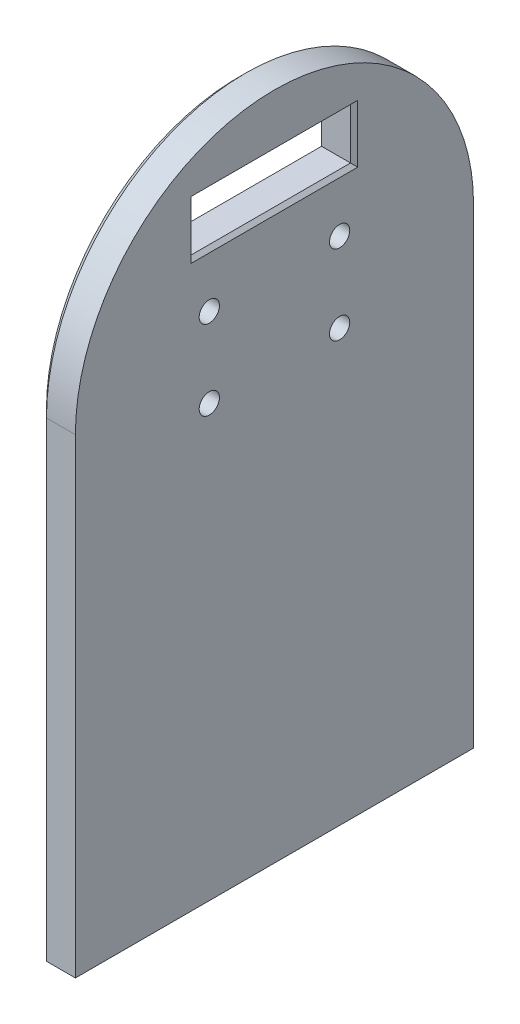
ISO-10303-21;
HEADER;
FILE_DESCRIPTION(('STEP AP214'),'2;1');
FILE_NAME('part.step','',(''),(''),'','','');
FILE_SCHEMA(('AUTOMOTIVE_DESIGN { 1 0 10303 214 1 1 1 1 }'));
ENDSEC;
DATA;
#1=APPLICATION_CONTEXT('core data for automotive mechanical design processes');
#2=APPLICATION_PROTOCOL_DEFINITION('international standard','automotive_design',2000,#1);
#3=PRODUCT_CONTEXT('',#1,'mechanical');
#4=PRODUCT('Part','Part','',(#3));
#5=PRODUCT_RELATED_PRODUCT_CATEGORY('part','',(#4));
#6=PRODUCT_DEFINITION_FORMATION('','',#4);
#7=PRODUCT_DEFINITION_CONTEXT('part definition',#1,'design');
#8=PRODUCT_DEFINITION('design','',#6,#7);
#9=PRODUCT_DEFINITION_SHAPE('','',#8);
#10=(LENGTH_UNIT() NAMED_UNIT(*) SI_UNIT(.MILLI.,.METRE.));
#11=(NAMED_UNIT(*) PLANE_ANGLE_UNIT() SI_UNIT($,.RADIAN.));
#12=(NAMED_UNIT(*) SI_UNIT($,.STERADIAN.) SOLID_ANGLE_UNIT());
#13=UNCERTAINTY_MEASURE_WITH_UNIT(LENGTH_MEASURE(1.E-05),#10,'distance_accuracy_value','');
#14=(GEOMETRIC_REPRESENTATION_CONTEXT(3) GLOBAL_UNCERTAINTY_ASSIGNED_CONTEXT((#13)) GLOBAL_UNIT_ASSIGNED_CONTEXT((#10,
#11,#12)) REPRESENTATION_CONTEXT('',''));
#15=CARTESIAN_POINT('',(0.,0.,0.));
#16=DIRECTION('',(0.,0.,1.));
#17=DIRECTION('',(1.,0.,0.));
#18=AXIS2_PLACEMENT_3D('',#15,#16,#17);
#19=CARTESIAN_POINT('',(5.,0.,0.));
#20=DIRECTION('',(-1.,0.,0.));
#21=DIRECTION('',(0.,0.,1.));
#22=AXIS2_PLACEMENT_3D('',#19,#20,#21);
#23=CYLINDRICAL_SURFACE('',#22,27.5);
#24=DIRECTION('',(-1.,0.,0.));
#25=VECTOR('',#24,1.);
#26=CARTESIAN_POINT('',(5.,0.,-27.5));
#27=LINE('',#26,#25);
#28=CARTESIAN_POINT('',(5.,0.,-27.5));
#29=VERTEX_POINT('',#28);
#30=CARTESIAN_POINT('',(1.,0.,-27.5));
#31=VERTEX_POINT('',#30);
#32=EDGE_CURVE('E305',#29,#31,#27,.T.);
#33=ORIENTED_EDGE('',*,*,#32,.T.);
#34=CARTESIAN_POINT('',(1.,0.,0.));
#35=DIRECTION('',(1.,0.,0.));
#36=DIRECTION('',(0.,0.,-1.));
#37=AXIS2_PLACEMENT_3D('',#34,#35,#36);
#38=CIRCLE('',#37,27.5);
#39=CARTESIAN_POINT('',(1.,0.,27.5));
#40=VERTEX_POINT('',#39);
#41=EDGE_CURVE('E166',#31,#40,#38,.T.);
#42=ORIENTED_EDGE('',*,*,#41,.T.);
#43=DIRECTION('',(-1.,0.,0.));
#44=VECTOR('',#43,1.);
#45=CARTESIAN_POINT('',(5.,0.,27.5));
#46=LINE('',#45,#44);
#47=CARTESIAN_POINT('',(5.,0.,27.5));
#48=VERTEX_POINT('',#47);
#49=EDGE_CURVE('E147',#48,#40,#46,.T.);
#50=ORIENTED_EDGE('',*,*,#49,.F.);
#51=CARTESIAN_POINT('',(5.,0.,0.));
#52=DIRECTION('',(1.,0.,0.));
#53=DIRECTION('',(0.,0.,-1.));
#54=AXIS2_PLACEMENT_3D('',#51,#52,#53);
#55=CIRCLE('',#54,27.5);
#56=EDGE_CURVE('E154',#29,#48,#55,.T.);
#57=ORIENTED_EDGE('',*,*,#56,.F.);
#58=EDGE_LOOP('',(#33,#42,#50,#57));
#59=FACE_BOUND('',#58,.T.);
#60=ADVANCED_FACE('F38',(#59),#23,.T.);
#61=CARTESIAN_POINT('',(5.,0.,27.5));
#62=DIRECTION('',(0.,0.,-1.));
#63=DIRECTION('',(0.,1.,0.));
#64=AXIS2_PLACEMENT_3D('',#61,#62,#63);
#65=PLANE('',#64);
#66=ORIENTED_EDGE('',*,*,#49,.T.);
#67=DIRECTION('',(0.,-1.,0.));
#68=VECTOR('',#67,1.);
#69=CARTESIAN_POINT('',(1.,0.,27.5));
#70=LINE('',#69,#68);
#71=CARTESIAN_POINT('',(1.,-65.,27.5));
#72=VERTEX_POINT('',#71);
#73=EDGE_CURVE('E167',#40,#72,#70,.T.);
#74=ORIENTED_EDGE('',*,*,#73,.T.);
#75=DIRECTION('',(-1.,0.,0.));
#76=VECTOR('',#75,1.);
#77=CARTESIAN_POINT('',(5.,-65.,27.5));
#78=LINE('',#77,#76);
#79=CARTESIAN_POINT('',(5.,-65.,27.5));
#80=VERTEX_POINT('',#79);
#81=EDGE_CURVE('E150',#80,#72,#78,.T.);
#82=ORIENTED_EDGE('',*,*,#81,.F.);
#83=DIRECTION('',(0.,-1.,0.));
#84=VECTOR('',#83,1.);
#85=CARTESIAN_POINT('',(5.,0.,27.5));
#86=LINE('',#85,#84);
#87=EDGE_CURVE('E142',#48,#80,#86,.T.);
#88=ORIENTED_EDGE('',*,*,#87,.F.);
#89=EDGE_LOOP('',(#66,#74,#82,#88));
#90=FACE_BOUND('',#89,.T.);
#91=ADVANCED_FACE('F144',(#90),#65,.F.);
#92=CARTESIAN_POINT('',(5.,-65.,27.5));
#93=DIRECTION('',(0.,1.,0.));
#94=DIRECTION('',(0.,0.,1.));
#95=AXIS2_PLACEMENT_3D('',#92,#93,#94);
#96=PLANE('',#95);
#97=ORIENTED_EDGE('',*,*,#81,.T.);
#98=DIRECTION('',(0.,0.,-1.));
#99=VECTOR('',#98,1.);
#100=CARTESIAN_POINT('',(1.,-65.,27.5));
#101=LINE('',#100,#99);
#102=CARTESIAN_POINT('',(1.,-65.,-27.5));
#103=VERTEX_POINT('',#102);
#104=EDGE_CURVE('E183',#72,#103,#101,.T.);
#105=ORIENTED_EDGE('',*,*,#104,.T.);
#106=DIRECTION('',(-1.,0.,0.));
#107=VECTOR('',#106,1.);
#108=CARTESIAN_POINT('',(5.,-65.,-27.5));
#109=LINE('',#108,#107);
#110=CARTESIAN_POINT('',(5.,-65.,-27.5));
#111=VERTEX_POINT('',#110);
#112=EDGE_CURVE('E171',#111,#103,#109,.T.);
#113=ORIENTED_EDGE('',*,*,#112,.F.);
#114=DIRECTION('',(0.,0.,-1.));
#115=VECTOR('',#114,1.);
#116=CARTESIAN_POINT('',(5.,-65.,27.5));
#117=LINE('',#116,#115);
#118=EDGE_CURVE('E153',#80,#111,#117,.T.);
#119=ORIENTED_EDGE('',*,*,#118,.F.);
#120=EDGE_LOOP('',(#97,#105,#113,#119));
#121=FACE_BOUND('',#120,.T.);
#122=ADVANCED_FACE('F347',(#121),#96,.F.);
#123=CARTESIAN_POINT('',(5.,-65.,-27.5));
#124=DIRECTION('',(0.,0.,1.));
#125=DIRECTION('',(0.,-1.,0.));
#126=AXIS2_PLACEMENT_3D('',#123,#124,#125);
#127=PLANE('',#126);
#128=ORIENTED_EDGE('',*,*,#112,.T.);
#129=DIRECTION('',(0.,1.,0.));
#130=VECTOR('',#129,1.);
#131=CARTESIAN_POINT('',(1.,-65.,-27.5));
#132=LINE('',#131,#130);
#133=EDGE_CURVE('E185',#103,#31,#132,.T.);
#134=ORIENTED_EDGE('',*,*,#133,.T.);
#135=ORIENTED_EDGE('',*,*,#32,.F.);
#136=DIRECTION('',(0.,1.,0.));
#137=VECTOR('',#136,1.);
#138=CARTESIAN_POINT('',(5.,-65.,-27.5));
#139=LINE('',#138,#137);
#140=EDGE_CURVE('E159',#111,#29,#139,.T.);
#141=ORIENTED_EDGE('',*,*,#140,.F.);
#142=EDGE_LOOP('',(#128,#134,#135,#141));
#143=FACE_BOUND('',#142,.T.);
#144=ADVANCED_FACE('F310',(#143),#127,.F.);
#145=CARTESIAN_POINT('',(5.,0.,0.));
#146=DIRECTION('',(1.,0.,0.));
#147=DIRECTION('',(0.,0.,-1.));
#148=AXIS2_PLACEMENT_3D('',#145,#146,#147);
#149=PLANE('',#148);
#150=DIRECTION('',(0.,0.,1.));
#151=VECTOR('',#150,1.);
#152=CARTESIAN_POINT('',(5.,12.5,11.));
#153=LINE('',#152,#151);
#154=CARTESIAN_POINT('',(5.,12.5,-11.5));
#155=VERTEX_POINT('',#154);
#156=CARTESIAN_POINT('',(5.,12.5,11.5));
#157=VERTEX_POINT('',#156);
#158=EDGE_CURVE('E227',#155,#157,#153,.T.);
#159=ORIENTED_EDGE('',*,*,#158,.T.);
#160=DIRECTION('',(0.,1.,0.));
#161=VECTOR('',#160,1.);
#162=CARTESIAN_POINT('',(5.,20.,11.5));
#163=LINE('',#162,#161);
#164=CARTESIAN_POINT('',(5.,20.5,11.5));
#165=VERTEX_POINT('',#164);
#166=EDGE_CURVE('E11',#157,#165,#163,.T.);
#167=ORIENTED_EDGE('',*,*,#166,.T.);
#168=DIRECTION('',(0.,0.,-1.));
#169=VECTOR('',#168,1.);
#170=CARTESIAN_POINT('',(5.,20.5,-11.));
#171=LINE('',#170,#169);
#172=CARTESIAN_POINT('',(5.,20.5,-11.5));
#173=VERTEX_POINT('',#172);
#174=EDGE_CURVE('E48',#165,#173,#171,.T.);
#175=ORIENTED_EDGE('',*,*,#174,.T.);
#176=DIRECTION('',(0.,-1.,0.));
#177=VECTOR('',#176,1.);
#178=CARTESIAN_POINT('',(5.,13.,-11.5));
#179=LINE('',#178,#177);
#180=EDGE_CURVE('E229',#173,#155,#179,.T.);
#181=ORIENTED_EDGE('',*,*,#180,.T.);
#182=EDGE_LOOP('',(#159,#167,#175,#181));
#183=FACE_BOUND('',#182,.T.);
#184=CARTESIAN_POINT('',(5.,-5.5,9.));
#185=DIRECTION('',(1.,0.,0.));
#186=DIRECTION('',(0.,0.,-1.));
#187=AXIS2_PLACEMENT_3D('',#184,#185,#186);
#188=CIRCLE('',#187,1.4);
#189=CARTESIAN_POINT('',(5.,-5.5,7.6));
#190=VERTEX_POINT('',#189);
#191=EDGE_CURVE('E200',#190,#190,#188,.T.);
#192=ORIENTED_EDGE('',*,*,#191,.F.);
#193=EDGE_LOOP('',(#192));
#194=FACE_BOUND('',#193,.T.);
#195=CARTESIAN_POINT('',(5.,-5.5,-9.));
#196=DIRECTION('',(1.,0.,0.));
#197=DIRECTION('',(0.,0.,-1.));
#198=AXIS2_PLACEMENT_3D('',#195,#196,#197);
#199=CIRCLE('',#198,1.4);
#200=CARTESIAN_POINT('',(5.,-5.5,-10.4));
#201=VERTEX_POINT('',#200);
#202=EDGE_CURVE('E291',#201,#201,#199,.T.);
#203=ORIENTED_EDGE('',*,*,#202,.F.);
#204=EDGE_LOOP('',(#203));
#205=FACE_BOUND('',#204,.T.);
#206=CARTESIAN_POINT('',(5.,5.5,-9.));
#207=DIRECTION('',(1.,0.,0.));
#208=DIRECTION('',(0.,0.,-1.));
#209=AXIS2_PLACEMENT_3D('',#206,#207,#208);
#210=CIRCLE('',#209,1.4);
#211=CARTESIAN_POINT('',(5.,5.5,-10.4));
#212=VERTEX_POINT('',#211);
#213=EDGE_CURVE('E285',#212,#212,#210,.T.);
#214=ORIENTED_EDGE('',*,*,#213,.F.);
#215=EDGE_LOOP('',(#214));
#216=FACE_BOUND('',#215,.T.);
#217=CARTESIAN_POINT('',(5.,5.5,9.));
#218=DIRECTION('',(1.,0.,0.));
#219=DIRECTION('',(0.,0.,-1.));
#220=AXIS2_PLACEMENT_3D('',#217,#218,#219);
#221=CIRCLE('',#220,1.4);
#222=CARTESIAN_POINT('',(5.,5.5,7.6));
#223=VERTEX_POINT('',#222);
#224=EDGE_CURVE('E284',#223,#223,#221,.T.);
#225=ORIENTED_EDGE('',*,*,#224,.F.);
#226=EDGE_LOOP('',(#225));
#227=FACE_BOUND('',#226,.T.);
#228=ORIENTED_EDGE('',*,*,#56,.T.);
#229=ORIENTED_EDGE('',*,*,#87,.T.);
#230=ORIENTED_EDGE('',*,*,#118,.T.);
#231=ORIENTED_EDGE('',*,*,#140,.T.);
#232=EDGE_LOOP('',(#228,#229,#230,#231));
#233=FACE_BOUND('',#232,.T.);
#234=ADVANCED_FACE('F157',(#183,#194,#205,#216,#227,#233),#149,.T.);
#235=CARTESIAN_POINT('',(0.,0.,0.));
#236=DIRECTION('',(1.,0.,0.));
#237=DIRECTION('',(0.,0.,-1.));
#238=AXIS2_PLACEMENT_3D('',#235,#236,#237);
#239=PLANE('',#238);
#240=DIRECTION('',(0.,0.,1.));
#241=VECTOR('',#240,1.);
#242=CARTESIAN_POINT('',(0.,20.5,0.));
#243=LINE('',#242,#241);
#244=CARTESIAN_POINT('',(0.,20.5,-11.5));
#245=VERTEX_POINT('',#244);
#246=CARTESIAN_POINT('',(0.,20.5,11.5));
#247=VERTEX_POINT('',#246);
#248=EDGE_CURVE('E210',#245,#247,#243,.T.);
#249=ORIENTED_EDGE('',*,*,#248,.T.);
#250=DIRECTION('',(0.,-1.,0.));
#251=VECTOR('',#250,1.);
#252=CARTESIAN_POINT('',(0.,0.,11.5));
#253=LINE('',#252,#251);
#254=CARTESIAN_POINT('',(0.,12.5,11.5));
#255=VERTEX_POINT('',#254);
#256=EDGE_CURVE('E212',#247,#255,#253,.T.);
#257=ORIENTED_EDGE('',*,*,#256,.T.);
#258=DIRECTION('',(0.,0.,-1.));
#259=VECTOR('',#258,1.);
#260=CARTESIAN_POINT('',(0.,12.5,0.));
#261=LINE('',#260,#259);
#262=CARTESIAN_POINT('',(0.,12.5,-11.5));
#263=VERTEX_POINT('',#262);
#264=EDGE_CURVE('E206',#255,#263,#261,.T.);
#265=ORIENTED_EDGE('',*,*,#264,.T.);
#266=DIRECTION('',(0.,1.,0.));
#267=VECTOR('',#266,1.);
#268=CARTESIAN_POINT('',(0.,0.,-11.5));
#269=LINE('',#268,#267);
#270=EDGE_CURVE('E208',#263,#245,#269,.T.);
#271=ORIENTED_EDGE('',*,*,#270,.T.);
#272=EDGE_LOOP('',(#249,#257,#265,#271));
#273=FACE_BOUND('',#272,.T.);
#274=DIRECTION('',(0.,0.,1.));
#275=VECTOR('',#274,1.);
#276=CARTESIAN_POINT('',(0.,-64.,0.));
#277=LINE('',#276,#275);
#278=CARTESIAN_POINT('',(0.,-64.,-26.5));
#279=VERTEX_POINT('',#278);
#280=CARTESIAN_POINT('',(0.,-64.,26.5));
#281=VERTEX_POINT('',#280);
#282=EDGE_CURVE('E178',#279,#281,#277,.T.);
#283=ORIENTED_EDGE('',*,*,#282,.T.);
#284=DIRECTION('',(0.,1.,0.));
#285=VECTOR('',#284,1.);
#286=CARTESIAN_POINT('',(0.,0.,26.5));
#287=LINE('',#286,#285);
#288=CARTESIAN_POINT('',(0.,0.,26.5));
#289=VERTEX_POINT('',#288);
#290=EDGE_CURVE('E180',#281,#289,#287,.T.);
#291=ORIENTED_EDGE('',*,*,#290,.T.);
#292=CARTESIAN_POINT('',(0.,0.,0.));
#293=DIRECTION('',(1.,0.,0.));
#294=DIRECTION('',(0.,0.,-1.));
#295=AXIS2_PLACEMENT_3D('',#292,#293,#294);
#296=CIRCLE('',#295,26.5);
#297=CARTESIAN_POINT('',(0.,0.,-26.5));
#298=VERTEX_POINT('',#297);
#299=EDGE_CURVE('E169',#289,#298,#296,.F.);
#300=ORIENTED_EDGE('',*,*,#299,.T.);
#301=DIRECTION('',(0.,-1.,0.));
#302=VECTOR('',#301,1.);
#303=CARTESIAN_POINT('',(0.,0.,-26.5));
#304=LINE('',#303,#302);
#305=EDGE_CURVE('E176',#298,#279,#304,.T.);
#306=ORIENTED_EDGE('',*,*,#305,.T.);
#307=EDGE_LOOP('',(#283,#291,#300,#306));
#308=FACE_BOUND('',#307,.T.);
#309=CARTESIAN_POINT('',(0.,-5.5,9.));
#310=DIRECTION('',(1.,0.,0.));
#311=DIRECTION('',(0.,0.,-1.));
#312=AXIS2_PLACEMENT_3D('',#309,#310,#311);
#313=CIRCLE('',#312,1.4);
#314=CARTESIAN_POINT('',(0.,-5.5,7.6));
#315=VERTEX_POINT('',#314);
#316=EDGE_CURVE('E294',#315,#315,#313,.T.);
#317=ORIENTED_EDGE('',*,*,#316,.T.);
#318=EDGE_LOOP('',(#317));
#319=FACE_BOUND('',#318,.T.);
#320=CARTESIAN_POINT('',(0.,-5.5,-9.));
#321=DIRECTION('',(1.,0.,0.));
#322=DIRECTION('',(0.,0.,-1.));
#323=AXIS2_PLACEMENT_3D('',#320,#321,#322);
#324=CIRCLE('',#323,1.4);
#325=CARTESIAN_POINT('',(0.,-5.5,-10.4));
#326=VERTEX_POINT('',#325);
#327=EDGE_CURVE('E288',#326,#326,#324,.T.);
#328=ORIENTED_EDGE('',*,*,#327,.T.);
#329=EDGE_LOOP('',(#328));
#330=FACE_BOUND('',#329,.T.);
#331=CARTESIAN_POINT('',(0.,5.5,-9.));
#332=DIRECTION('',(1.,0.,0.));
#333=DIRECTION('',(0.,0.,-1.));
#334=AXIS2_PLACEMENT_3D('',#331,#332,#333);
#335=CIRCLE('',#334,1.4);
#336=CARTESIAN_POINT('',(0.,5.5,-10.4));
#337=VERTEX_POINT('',#336);
#338=EDGE_CURVE('E281',#337,#337,#335,.T.);
#339=ORIENTED_EDGE('',*,*,#338,.T.);
#340=EDGE_LOOP('',(#339));
#341=FACE_BOUND('',#340,.T.);
#342=CARTESIAN_POINT('',(0.,5.5,9.));
#343=DIRECTION('',(1.,0.,0.));
#344=DIRECTION('',(0.,0.,-1.));
#345=AXIS2_PLACEMENT_3D('',#342,#343,#344);
#346=CIRCLE('',#345,1.4);
#347=CARTESIAN_POINT('',(0.,5.5,7.6));
#348=VERTEX_POINT('',#347);
#349=EDGE_CURVE('E163',#348,#348,#346,.T.);
#350=ORIENTED_EDGE('',*,*,#349,.T.);
#351=EDGE_LOOP('',(#350));
#352=FACE_BOUND('',#351,.T.);
#353=ADVANCED_FACE('F324',(#273,#308,#319,#330,#341,#352),#239,.F.);
#354=CARTESIAN_POINT('',(0.,5.5,9.));
#355=DIRECTION('',(1.,0.,0.));
#356=DIRECTION('',(0.,0.,-1.));
#357=AXIS2_PLACEMENT_3D('',#354,#355,#356);
#358=CYLINDRICAL_SURFACE('',#357,1.4);
#359=ORIENTED_EDGE('',*,*,#349,.F.);
#360=EDGE_LOOP('',(#359));
#361=FACE_BOUND('',#360,.T.);
#362=ORIENTED_EDGE('',*,*,#224,.T.);
#363=EDGE_LOOP('',(#362));
#364=FACE_BOUND('',#363,.T.);
#365=ADVANCED_FACE('F530',(#361,#364),#358,.F.);
#366=CARTESIAN_POINT('',(0.,5.5,-9.));
#367=DIRECTION('',(1.,0.,0.));
#368=DIRECTION('',(0.,0.,-1.));
#369=AXIS2_PLACEMENT_3D('',#366,#367,#368);
#370=CYLINDRICAL_SURFACE('',#369,1.4);
#371=ORIENTED_EDGE('',*,*,#338,.F.);
#372=EDGE_LOOP('',(#371));
#373=FACE_BOUND('',#372,.T.);
#374=ORIENTED_EDGE('',*,*,#213,.T.);
#375=EDGE_LOOP('',(#374));
#376=FACE_BOUND('',#375,.T.);
#377=ADVANCED_FACE('F520',(#373,#376),#370,.F.);
#378=CARTESIAN_POINT('',(0.,-5.5,-9.));
#379=DIRECTION('',(1.,0.,0.));
#380=DIRECTION('',(0.,0.,-1.));
#381=AXIS2_PLACEMENT_3D('',#378,#379,#380);
#382=CYLINDRICAL_SURFACE('',#381,1.4);
#383=ORIENTED_EDGE('',*,*,#327,.F.);
#384=EDGE_LOOP('',(#383));
#385=FACE_BOUND('',#384,.T.);
#386=ORIENTED_EDGE('',*,*,#202,.T.);
#387=EDGE_LOOP('',(#386));
#388=FACE_BOUND('',#387,.T.);
#389=ADVANCED_FACE('F510',(#385,#388),#382,.F.);
#390=CARTESIAN_POINT('',(0.,-5.5,9.));
#391=DIRECTION('',(1.,0.,0.));
#392=DIRECTION('',(0.,0.,-1.));
#393=AXIS2_PLACEMENT_3D('',#390,#391,#392);
#394=CYLINDRICAL_SURFACE('',#393,1.4);
#395=ORIENTED_EDGE('',*,*,#316,.F.);
#396=EDGE_LOOP('',(#395));
#397=FACE_BOUND('',#396,.T.);
#398=ORIENTED_EDGE('',*,*,#191,.T.);
#399=EDGE_LOOP('',(#398));
#400=FACE_BOUND('',#399,.T.);
#401=ADVANCED_FACE('F339',(#397,#400),#394,.F.);
#402=CARTESIAN_POINT('',(1.,-65.,-27.5));
#403=DIRECTION('',(0.70710678118655,0.,0.707106781186545));
#404=DIRECTION('',(0.,1.,0.));
#405=AXIS2_PLACEMENT_3D('',#402,#403,#404);
#406=PLANE('',#405);
#407=DIRECTION('',(-0.577350269189622,0.577350269189628,0.577350269189626));
#408=VECTOR('',#407,1.);
#409=CARTESIAN_POINT('',(1.,-65.,-27.5));
#410=LINE('',#409,#408);
#411=EDGE_CURVE('E194',#279,#103,#410,.F.);
#412=ORIENTED_EDGE('',*,*,#411,.F.);
#413=ORIENTED_EDGE('',*,*,#305,.F.);
#414=DIRECTION('',(-0.707106781186545,0.,0.70710678118655));
#415=VECTOR('',#414,1.);
#416=CARTESIAN_POINT('',(1.,0.,-27.5));
#417=LINE('',#416,#415);
#418=EDGE_CURVE('E197',#31,#298,#417,.T.);
#419=ORIENTED_EDGE('',*,*,#418,.F.);
#420=ORIENTED_EDGE('',*,*,#133,.F.);
#421=EDGE_LOOP('',(#412,#413,#419,#420));
#422=FACE_BOUND('',#421,.T.);
#423=ADVANCED_FACE('F315',(#422),#406,.F.);
#424=CARTESIAN_POINT('',(1.,0.,0.));
#425=DIRECTION('',(1.,0.,0.));
#426=DIRECTION('',(0.,0.,-1.));
#427=AXIS2_PLACEMENT_3D('',#424,#425,#426);
#428=CONICAL_SURFACE('',#427,27.5,0.785398163397452);
#429=ORIENTED_EDGE('',*,*,#418,.T.);
#430=ORIENTED_EDGE('',*,*,#299,.F.);
#431=DIRECTION('',(-0.707106781186545,0.,-0.70710678118655));
#432=VECTOR('',#431,1.);
#433=CARTESIAN_POINT('',(1.,0.,27.5));
#434=LINE('',#433,#432);
#435=EDGE_CURVE('E191',#40,#289,#434,.T.);
#436=ORIENTED_EDGE('',*,*,#435,.F.);
#437=ORIENTED_EDGE('',*,*,#41,.F.);
#438=EDGE_LOOP('',(#429,#430,#436,#437));
#439=FACE_BOUND('',#438,.T.);
#440=ADVANCED_FACE('F331',(#439),#428,.T.);
#441=CARTESIAN_POINT('',(1.,-65.,27.5));
#442=DIRECTION('',(0.707106781186551,0.707106781186544,0.));
#443=DIRECTION('',(0.,0.,-1.));
#444=AXIS2_PLACEMENT_3D('',#441,#442,#443);
#445=PLANE('',#444);
#446=ORIENTED_EDGE('',*,*,#411,.T.);
#447=ORIENTED_EDGE('',*,*,#104,.F.);
#448=DIRECTION('',(-0.577350269189622,0.577350269189628,-0.577350269189626));
#449=VECTOR('',#448,1.);
#450=CARTESIAN_POINT('',(1.,-65.,27.5));
#451=LINE('',#450,#449);
#452=EDGE_CURVE('E189',#281,#72,#451,.F.);
#453=ORIENTED_EDGE('',*,*,#452,.F.);
#454=ORIENTED_EDGE('',*,*,#282,.F.);
#455=EDGE_LOOP('',(#446,#447,#453,#454));
#456=FACE_BOUND('',#455,.T.);
#457=ADVANCED_FACE('F320',(#456),#445,.F.);
#458=CARTESIAN_POINT('',(1.,0.,27.5));
#459=DIRECTION('',(0.70710678118655,0.,-0.707106781186545));
#460=DIRECTION('',(0.,-1.,0.));
#461=AXIS2_PLACEMENT_3D('',#458,#459,#460);
#462=PLANE('',#461);
#463=ORIENTED_EDGE('',*,*,#435,.T.);
#464=ORIENTED_EDGE('',*,*,#290,.F.);
#465=ORIENTED_EDGE('',*,*,#452,.T.);
#466=ORIENTED_EDGE('',*,*,#73,.F.);
#467=EDGE_LOOP('',(#463,#464,#465,#466));
#468=FACE_BOUND('',#467,.T.);
#469=ADVANCED_FACE('F327',(#468),#462,.F.);
#470=CARTESIAN_POINT('',(10.,20.,-11.));
#471=DIRECTION('',(0.,0.,-1.));
#472=DIRECTION('',(0.,1.,0.));
#473=AXIS2_PLACEMENT_3D('',#470,#471,#472);
#474=PLANE('',#473);
#475=DIRECTION('',(-1.,0.,0.));
#476=VECTOR('',#475,1.);
#477=CARTESIAN_POINT('',(10.,20.,-11.));
#478=LINE('',#477,#476);
#479=CARTESIAN_POINT('',(4.5,20.,-11.));
#480=VERTEX_POINT('',#479);
#481=CARTESIAN_POINT('',(0.5,20.,-11.));
#482=VERTEX_POINT('',#481);
#483=EDGE_CURVE('E192',#480,#482,#478,.T.);
#484=ORIENTED_EDGE('',*,*,#483,.T.);
#485=DIRECTION('',(0.,-1.,0.));
#486=VECTOR('',#485,1.);
#487=CARTESIAN_POINT('',(0.5,20.,-11.));
#488=LINE('',#487,#486);
#489=CARTESIAN_POINT('',(0.5,13.,-11.));
#490=VERTEX_POINT('',#489);
#491=EDGE_CURVE('E221',#482,#490,#488,.T.);
#492=ORIENTED_EDGE('',*,*,#491,.T.);
#493=DIRECTION('',(-1.,0.,0.));
#494=VECTOR('',#493,1.);
#495=CARTESIAN_POINT('',(10.,13.,-11.));
#496=LINE('',#495,#494);
#497=CARTESIAN_POINT('',(4.5,13.,-11.));
#498=VERTEX_POINT('',#497);
#499=EDGE_CURVE('E242',#498,#490,#496,.T.);
#500=ORIENTED_EDGE('',*,*,#499,.F.);
#501=DIRECTION('',(0.,1.,0.));
#502=VECTOR('',#501,1.);
#503=CARTESIAN_POINT('',(4.5,20.,-11.));
#504=LINE('',#503,#502);
#505=EDGE_CURVE('E219',#498,#480,#504,.T.);
#506=ORIENTED_EDGE('',*,*,#505,.T.);
#507=EDGE_LOOP('',(#484,#492,#500,#506));
#508=FACE_BOUND('',#507,.T.);
#509=ADVANCED_FACE('F357',(#508),#474,.F.);
#510=CARTESIAN_POINT('',(10.,20.,-11.));
#511=DIRECTION('',(0.,1.,0.));
#512=DIRECTION('',(0.,0.,1.));
#513=AXIS2_PLACEMENT_3D('',#510,#511,#512);
#514=PLANE('',#513);
#515=DIRECTION('',(-1.,0.,0.));
#516=VECTOR('',#515,1.);
#517=CARTESIAN_POINT('',(10.,20.,11.));
#518=LINE('',#517,#516);
#519=CARTESIAN_POINT('',(4.5,20.,11.));
#520=VERTEX_POINT('',#519);
#521=CARTESIAN_POINT('',(0.5,20.,11.));
#522=VERTEX_POINT('',#521);
#523=EDGE_CURVE('E273',#520,#522,#518,.T.);
#524=ORIENTED_EDGE('',*,*,#523,.T.);
#525=DIRECTION('',(0.,0.,-1.));
#526=VECTOR('',#525,1.);
#527=CARTESIAN_POINT('',(0.5,20.,-11.));
#528=LINE('',#527,#526);
#529=EDGE_CURVE('E217',#522,#482,#528,.T.);
#530=ORIENTED_EDGE('',*,*,#529,.T.);
#531=ORIENTED_EDGE('',*,*,#483,.F.);
#532=DIRECTION('',(0.,0.,1.));
#533=VECTOR('',#532,1.);
#534=CARTESIAN_POINT('',(4.5,20.,11.));
#535=LINE('',#534,#533);
#536=EDGE_CURVE('E215',#480,#520,#535,.T.);
#537=ORIENTED_EDGE('',*,*,#536,.T.);
#538=EDGE_LOOP('',(#524,#530,#531,#537));
#539=FACE_BOUND('',#538,.T.);
#540=ADVANCED_FACE('F439',(#539),#514,.F.);
#541=CARTESIAN_POINT('',(10.,20.,11.));
#542=DIRECTION('',(0.,0.,1.));
#543=DIRECTION('',(0.,-1.,0.));
#544=AXIS2_PLACEMENT_3D('',#541,#542,#543);
#545=PLANE('',#544);
#546=DIRECTION('',(-1.,0.,0.));
#547=VECTOR('',#546,1.);
#548=CARTESIAN_POINT('',(10.,13.,11.));
#549=LINE('',#548,#547);
#550=CARTESIAN_POINT('',(4.5,13.,11.));
#551=VERTEX_POINT('',#550);
#552=CARTESIAN_POINT('',(0.5,13.,11.));
#553=VERTEX_POINT('',#552);
#554=EDGE_CURVE('E270',#551,#553,#549,.T.);
#555=ORIENTED_EDGE('',*,*,#554,.T.);
#556=DIRECTION('',(0.,1.,0.));
#557=VECTOR('',#556,1.);
#558=CARTESIAN_POINT('',(0.5,20.,11.));
#559=LINE('',#558,#557);
#560=EDGE_CURVE('E203',#553,#522,#559,.T.);
#561=ORIENTED_EDGE('',*,*,#560,.T.);
#562=ORIENTED_EDGE('',*,*,#523,.F.);
#563=DIRECTION('',(0.,-1.,0.));
#564=VECTOR('',#563,1.);
#565=CARTESIAN_POINT('',(4.5,13.,11.));
#566=LINE('',#565,#564);
#567=EDGE_CURVE('E188',#520,#551,#566,.T.);
#568=ORIENTED_EDGE('',*,*,#567,.T.);
#569=EDGE_LOOP('',(#555,#561,#562,#568));
#570=FACE_BOUND('',#569,.T.);
#571=ADVANCED_FACE('F269',(#570),#545,.F.);
#572=CARTESIAN_POINT('',(10.,13.,-11.));
#573=DIRECTION('',(0.,-1.,0.));
#574=DIRECTION('',(0.,0.,-1.));
#575=AXIS2_PLACEMENT_3D('',#572,#573,#574);
#576=PLANE('',#575);
#577=ORIENTED_EDGE('',*,*,#499,.T.);
#578=DIRECTION('',(0.,0.,1.));
#579=VECTOR('',#578,1.);
#580=CARTESIAN_POINT('',(0.5,13.,-11.));
#581=LINE('',#580,#579);
#582=EDGE_CURVE('E225',#490,#553,#581,.T.);
#583=ORIENTED_EDGE('',*,*,#582,.T.);
#584=ORIENTED_EDGE('',*,*,#554,.F.);
#585=DIRECTION('',(0.,0.,-1.));
#586=VECTOR('',#585,1.);
#587=CARTESIAN_POINT('',(4.5,13.,-11.));
#588=LINE('',#587,#586);
#589=EDGE_CURVE('E223',#551,#498,#588,.T.);
#590=ORIENTED_EDGE('',*,*,#589,.T.);
#591=EDGE_LOOP('',(#577,#583,#584,#590));
#592=FACE_BOUND('',#591,.T.);
#593=ADVANCED_FACE('F274',(#592),#576,.F.);
#594=CARTESIAN_POINT('',(0.5,20.,-11.));
#595=DIRECTION('',(0.707106781186547,0.,-0.707106781186548));
#596=DIRECTION('',(0.,-1.,0.));
#597=AXIS2_PLACEMENT_3D('',#594,#595,#596);
#598=PLANE('',#597);
#599=DIRECTION('',(-0.577350269189626,0.577350269189626,-0.577350269189626));
#600=VECTOR('',#599,1.);
#601=CARTESIAN_POINT('',(0.5,20.,-11.));
#602=LINE('',#601,#600);
#603=EDGE_CURVE('E236',#245,#482,#602,.F.);
#604=ORIENTED_EDGE('',*,*,#603,.F.);
#605=ORIENTED_EDGE('',*,*,#270,.F.);
#606=DIRECTION('',(-0.577350269189626,-0.577350269189626,-0.577350269189626));
#607=VECTOR('',#606,1.);
#608=CARTESIAN_POINT('',(2.83333333333333,15.3333333333333,-8.66666666666667));
#609=LINE('',#608,#607);
#610=EDGE_CURVE('E239',#490,#263,#609,.T.);
#611=ORIENTED_EDGE('',*,*,#610,.F.);
#612=ORIENTED_EDGE('',*,*,#491,.F.);
#613=EDGE_LOOP('',(#604,#605,#611,#612));
#614=FACE_BOUND('',#613,.T.);
#615=ADVANCED_FACE('F386',(#614),#598,.F.);
#616=CARTESIAN_POINT('',(0.5,13.,-11.));
#617=DIRECTION('',(0.707106781186547,-0.707106781186547,0.));
#618=DIRECTION('',(0.,0.,1.));
#619=AXIS2_PLACEMENT_3D('',#616,#617,#618);
#620=PLANE('',#619);
#621=ORIENTED_EDGE('',*,*,#610,.T.);
#622=ORIENTED_EDGE('',*,*,#264,.F.);
#623=DIRECTION('',(0.577350269189626,0.577350269189626,-0.577350269189626));
#624=VECTOR('',#623,1.);
#625=CARTESIAN_POINT('',(2.83333333333333,15.3333333333333,8.66666666666667));
#626=LINE('',#625,#624);
#627=EDGE_CURVE('E234',#553,#255,#626,.F.);
#628=ORIENTED_EDGE('',*,*,#627,.F.);
#629=ORIENTED_EDGE('',*,*,#582,.F.);
#630=EDGE_LOOP('',(#621,#622,#628,#629));
#631=FACE_BOUND('',#630,.T.);
#632=ADVANCED_FACE('F380',(#631),#620,.F.);
#633=CARTESIAN_POINT('',(0.5,20.,-11.));
#634=DIRECTION('',(0.707106781186547,0.707106781186547,0.));
#635=DIRECTION('',(0.,0.,-1.));
#636=AXIS2_PLACEMENT_3D('',#633,#634,#635);
#637=PLANE('',#636);
#638=ORIENTED_EDGE('',*,*,#603,.T.);
#639=ORIENTED_EDGE('',*,*,#529,.F.);
#640=DIRECTION('',(-0.577350269189626,0.577350269189626,0.577350269189626));
#641=VECTOR('',#640,1.);
#642=CARTESIAN_POINT('',(0.5,20.,11.));
#643=LINE('',#642,#641);
#644=EDGE_CURVE('E232',#247,#522,#643,.F.);
#645=ORIENTED_EDGE('',*,*,#644,.F.);
#646=ORIENTED_EDGE('',*,*,#248,.F.);
#647=EDGE_LOOP('',(#638,#639,#645,#646));
#648=FACE_BOUND('',#647,.T.);
#649=ADVANCED_FACE('F373',(#648),#637,.F.);
#650=CARTESIAN_POINT('',(0.5,20.,11.));
#651=DIRECTION('',(0.707106781186548,0.,0.707106781186547));
#652=DIRECTION('',(0.,1.,0.));
#653=AXIS2_PLACEMENT_3D('',#650,#651,#652);
#654=PLANE('',#653);
#655=ORIENTED_EDGE('',*,*,#627,.T.);
#656=ORIENTED_EDGE('',*,*,#256,.F.);
#657=ORIENTED_EDGE('',*,*,#644,.T.);
#658=ORIENTED_EDGE('',*,*,#560,.F.);
#659=EDGE_LOOP('',(#655,#656,#657,#658));
#660=FACE_BOUND('',#659,.T.);
#661=ADVANCED_FACE('F367',(#660),#654,.F.);
#662=CARTESIAN_POINT('',(4.5,20.,-11.));
#663=DIRECTION('',(0.707106781186547,0.,0.707106781186548));
#664=DIRECTION('',(0.,-1.,0.));
#665=AXIS2_PLACEMENT_3D('',#662,#663,#664);
#666=PLANE('',#665);
#667=DIRECTION('',(-0.577350269189626,0.577350269189626,0.577350269189626));
#668=VECTOR('',#667,1.);
#669=CARTESIAN_POINT('',(2.16666666666667,15.3333333333333,-8.66666666666667));
#670=LINE('',#669,#668);
#671=EDGE_CURVE('E245',#155,#498,#670,.T.);
#672=ORIENTED_EDGE('',*,*,#671,.F.);
#673=ORIENTED_EDGE('',*,*,#180,.F.);
#674=DIRECTION('',(-0.577350269189626,-0.577350269189626,0.577350269189626));
#675=VECTOR('',#674,1.);
#676=CARTESIAN_POINT('',(4.5,20.,-11.));
#677=LINE('',#676,#675);
#678=EDGE_CURVE('E43',#480,#173,#677,.F.);
#679=ORIENTED_EDGE('',*,*,#678,.F.);
#680=ORIENTED_EDGE('',*,*,#505,.F.);
#681=EDGE_LOOP('',(#672,#673,#679,#680));
#682=FACE_BOUND('',#681,.T.);
#683=ADVANCED_FACE('F41',(#682),#666,.T.);
#684=CARTESIAN_POINT('',(4.5,20.,-11.));
#685=DIRECTION('',(0.707106781186547,-0.707106781186547,0.));
#686=DIRECTION('',(0.,0.,-1.));
#687=AXIS2_PLACEMENT_3D('',#684,#685,#686);
#688=PLANE('',#687);
#689=ORIENTED_EDGE('',*,*,#678,.T.);
#690=ORIENTED_EDGE('',*,*,#174,.F.);
#691=DIRECTION('',(-0.577350269189626,-0.577350269189626,-0.577350269189626));
#692=VECTOR('',#691,1.);
#693=CARTESIAN_POINT('',(4.5,20.,11.));
#694=LINE('',#693,#692);
#695=EDGE_CURVE('E56',#520,#165,#694,.F.);
#696=ORIENTED_EDGE('',*,*,#695,.F.);
#697=ORIENTED_EDGE('',*,*,#536,.F.);
#698=EDGE_LOOP('',(#689,#690,#696,#697));
#699=FACE_BOUND('',#698,.T.);
#700=ADVANCED_FACE('F255',(#699),#688,.T.);
#701=CARTESIAN_POINT('',(4.5,13.,-11.));
#702=DIRECTION('',(0.707106781186547,0.707106781186547,0.));
#703=DIRECTION('',(0.,0.,1.));
#704=AXIS2_PLACEMENT_3D('',#701,#702,#703);
#705=PLANE('',#704);
#706=ORIENTED_EDGE('',*,*,#671,.T.);
#707=ORIENTED_EDGE('',*,*,#589,.F.);
#708=DIRECTION('',(0.577350269189626,-0.577350269189626,0.577350269189626));
#709=VECTOR('',#708,1.);
#710=CARTESIAN_POINT('',(2.16666666666667,15.3333333333333,8.66666666666667));
#711=LINE('',#710,#709);
#712=EDGE_CURVE('E243',#157,#551,#711,.F.);
#713=ORIENTED_EDGE('',*,*,#712,.F.);
#714=ORIENTED_EDGE('',*,*,#158,.F.);
#715=EDGE_LOOP('',(#706,#707,#713,#714));
#716=FACE_BOUND('',#715,.T.);
#717=ADVANCED_FACE('F261',(#716),#705,.T.);
#718=CARTESIAN_POINT('',(4.5,20.,11.));
#719=DIRECTION('',(0.707106781186548,0.,-0.707106781186547));
#720=DIRECTION('',(0.,1.,0.));
#721=AXIS2_PLACEMENT_3D('',#718,#719,#720);
#722=PLANE('',#721);
#723=ORIENTED_EDGE('',*,*,#695,.T.);
#724=ORIENTED_EDGE('',*,*,#166,.F.);
#725=ORIENTED_EDGE('',*,*,#712,.T.);
#726=ORIENTED_EDGE('',*,*,#567,.F.);
#727=EDGE_LOOP('',(#723,#724,#725,#726));
#728=FACE_BOUND('',#727,.T.);
#729=ADVANCED_FACE('F260',(#728),#722,.T.);
#730=CLOSED_SHELL('',(#60,#91,#122,#144,#234,#353,#365,#377,#389,#401,#423,#440,#457,#469,#509,
#540,#571,#593,#615,#632,#649,#661,#683,#700,#717,#729));
#731=MANIFOLD_SOLID_BREP('B2',#730);
#732=ADVANCED_BREP_SHAPE_REPRESENTATION('',(#18,#731),#14);
#733=SHAPE_DEFINITION_REPRESENTATION(#9,#732);
ENDSEC;
END-ISO-10303-21;
